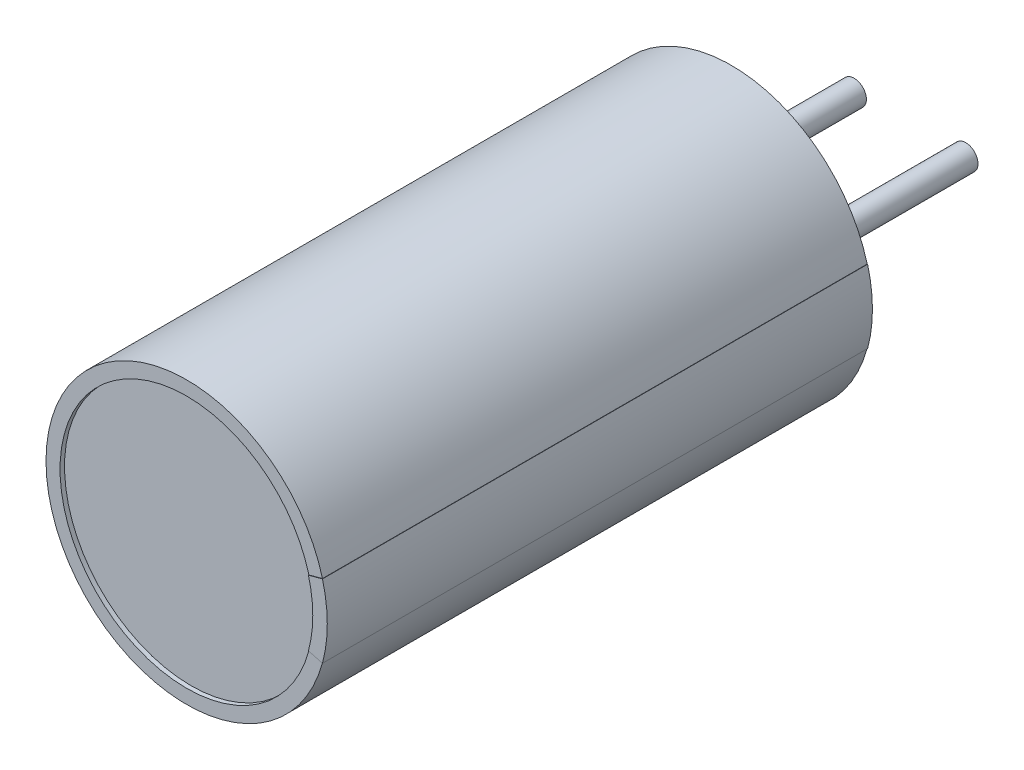
ISO-10303-21;
HEADER;
FILE_DESCRIPTION(('STEP AP214'),'2;1');
FILE_NAME('part.step','',(''),(''),'','','');
FILE_SCHEMA(('AUTOMOTIVE_DESIGN { 1 0 10303 214 1 1 1 1 }'));
ENDSEC;
DATA;
#1=APPLICATION_CONTEXT('core data for automotive mechanical design processes');
#2=APPLICATION_PROTOCOL_DEFINITION('international standard','automotive_design',2000,#1);
#3=PRODUCT_CONTEXT('',#1,'mechanical');
#4=PRODUCT('Part','Part','',(#3));
#5=PRODUCT_RELATED_PRODUCT_CATEGORY('part','',(#4));
#6=PRODUCT_DEFINITION_FORMATION('','',#4);
#7=PRODUCT_DEFINITION_CONTEXT('part definition',#1,'design');
#8=PRODUCT_DEFINITION('design','',#6,#7);
#9=PRODUCT_DEFINITION_SHAPE('','',#8);
#10=(LENGTH_UNIT() NAMED_UNIT(*) SI_UNIT(.MILLI.,.METRE.));
#11=(NAMED_UNIT(*) PLANE_ANGLE_UNIT() SI_UNIT($,.RADIAN.));
#12=(NAMED_UNIT(*) SI_UNIT($,.STERADIAN.) SOLID_ANGLE_UNIT());
#13=UNCERTAINTY_MEASURE_WITH_UNIT(LENGTH_MEASURE(1.E-05),#10,'distance_accuracy_value','');
#14=(GEOMETRIC_REPRESENTATION_CONTEXT(3) GLOBAL_UNCERTAINTY_ASSIGNED_CONTEXT((#13)) GLOBAL_UNIT_ASSIGNED_CONTEXT((#10,
#11,#12)) REPRESENTATION_CONTEXT('',''));
#15=CARTESIAN_POINT('',(0.,0.,0.));
#16=DIRECTION('',(0.,0.,1.));
#17=DIRECTION('',(1.,0.,0.));
#18=AXIS2_PLACEMENT_3D('',#15,#16,#17);
#19=CARTESIAN_POINT('',(-1.24987808,0.000121920000000306,0.));
#20=DIRECTION('',(0.,0.,-1.));
#21=DIRECTION('',(1.,0.,0.));
#22=AXIS2_PLACEMENT_3D('',#19,#20,#21);
#23=CYLINDRICAL_SURFACE('',#22,0.275);
#24=CARTESIAN_POINT('',(-1.24987808,0.000121920000000306,-4.));
#25=DIRECTION('',(0.,0.,1.));
#26=DIRECTION('',(1.,0.,0.));
#27=AXIS2_PLACEMENT_3D('',#24,#25,#26);
#28=CIRCLE('',#27,0.275);
#29=CARTESIAN_POINT('',(-0.97487808,0.000121920000000239,-4.));
#30=VERTEX_POINT('',#29);
#31=EDGE_CURVE('E10',#30,#30,#28,.T.);
#32=ORIENTED_EDGE('',*,*,#31,.T.);
#33=CARTESIAN_POINT('',(-0.97487808,0.000121920000000306,0.));
#34=CARTESIAN_POINT('',(-0.97487808,0.000121920000000306,-4.));
#35=B_SPLINE_CURVE_WITH_KNOTS('',1,(#33,#34),.UNSPECIFIED.,.F.,.F.,(2,2),(0.,4.),.UNSPECIFIED.);
#36=CARTESIAN_POINT('',(-0.97487808,0.000121920000000239,0.));
#37=VERTEX_POINT('',#36);
#38=EDGE_CURVE('E23',#37,#30,#35,.T.);
#39=ORIENTED_EDGE('',*,*,#38,.F.);
#40=CARTESIAN_POINT('',(-1.24987808,0.000121920000000306,0.));
#41=DIRECTION('',(0.,0.,1.));
#42=DIRECTION('',(1.,0.,0.));
#43=AXIS2_PLACEMENT_3D('',#40,#41,#42);
#44=CIRCLE('',#43,0.275);
#45=EDGE_CURVE('E162',#37,#37,#44,.T.);
#46=ORIENTED_EDGE('',*,*,#45,.F.);
#47=ORIENTED_EDGE('',*,*,#38,.T.);
#48=EDGE_LOOP('',(#32,#39,#46,#47));
#49=FACE_BOUND('',#48,.T.);
#50=ADVANCED_FACE('F16',(#49),#23,.T.);
#51=CARTESIAN_POINT('',(-1.24987808,0.000121920000000306,-4.));
#52=DIRECTION('',(0.,0.,1.));
#53=DIRECTION('',(1.,0.,0.));
#54=AXIS2_PLACEMENT_3D('',#51,#52,#53);
#55=PLANE('',#54);
#56=ORIENTED_EDGE('',*,*,#31,.F.);
#57=EDGE_LOOP('',(#56));
#58=FACE_BOUND('',#57,.T.);
#59=ADVANCED_FACE('F190',(#58),#55,.F.);
#60=CARTESIAN_POINT('',(1.25012192,0.000121919999999694,0.));
#61=DIRECTION('',(0.,0.,-1.));
#62=DIRECTION('',(-1.,0.,0.));
#63=AXIS2_PLACEMENT_3D('',#60,#61,#62);
#64=CYLINDRICAL_SURFACE('',#63,0.275);
#65=CARTESIAN_POINT('',(1.25012192,0.000121919999999694,-4.));
#66=DIRECTION('',(0.,0.,1.));
#67=DIRECTION('',(-1.,0.,0.));
#68=AXIS2_PLACEMENT_3D('',#65,#66,#67);
#69=CIRCLE('',#68,0.275);
#70=CARTESIAN_POINT('',(0.97512192,0.000121919999999761,-4.));
#71=VERTEX_POINT('',#70);
#72=EDGE_CURVE('E157',#71,#71,#69,.T.);
#73=ORIENTED_EDGE('',*,*,#72,.T.);
#74=CARTESIAN_POINT('',(0.97512192,0.000121919999999694,0.));
#75=CARTESIAN_POINT('',(0.97512192,0.000121919999999694,-4.));
#76=B_SPLINE_CURVE_WITH_KNOTS('',1,(#74,#75),.UNSPECIFIED.,.F.,.F.,(2,2),(0.,4.),.UNSPECIFIED.);
#77=CARTESIAN_POINT('',(0.97512192,0.000121919999999761,0.));
#78=VERTEX_POINT('',#77);
#79=EDGE_CURVE('E152',#78,#71,#76,.T.);
#80=ORIENTED_EDGE('',*,*,#79,.F.);
#81=CARTESIAN_POINT('',(1.25012192,0.000121919999999694,0.));
#82=DIRECTION('',(0.,0.,1.));
#83=DIRECTION('',(-1.,0.,0.));
#84=AXIS2_PLACEMENT_3D('',#81,#82,#83);
#85=CIRCLE('',#84,0.275);
#86=EDGE_CURVE('E149',#78,#78,#85,.T.);
#87=ORIENTED_EDGE('',*,*,#86,.F.);
#88=ORIENTED_EDGE('',*,*,#79,.T.);
#89=EDGE_LOOP('',(#73,#80,#87,#88));
#90=FACE_BOUND('',#89,.T.);
#91=ADVANCED_FACE('F175',(#90),#64,.T.);
#92=CARTESIAN_POINT('',(1.25012192,0.000121919999999694,-4.));
#93=DIRECTION('',(0.,0.,-1.));
#94=DIRECTION('',(-1.,0.,0.));
#95=AXIS2_PLACEMENT_3D('',#92,#93,#94);
#96=PLANE('',#95);
#97=ORIENTED_EDGE('',*,*,#72,.F.);
#98=EDGE_LOOP('',(#97));
#99=FACE_BOUND('',#98,.T.);
#100=ADVANCED_FACE('F178',(#99),#96,.T.);
#101=CARTESIAN_POINT('',(0.00012192,0.00012192,0.));
#102=DIRECTION('',(0.,0.,1.));
#103=DIRECTION('',(-1.,0.,0.));
#104=AXIS2_PLACEMENT_3D('',#101,#102,#103);
#105=CYLINDRICAL_SURFACE('',#104,3.15);
#106=CARTESIAN_POINT('',(0.00012192,0.00012192,12.2));
#107=DIRECTION('',(0.,0.,-1.));
#108=DIRECTION('',(-1.,0.,0.));
#109=AXIS2_PLACEMENT_3D('',#106,#107,#108);
#110=CIRCLE('',#109,3.15);
#111=CARTESIAN_POINT('',(3.042743176025,-0.815326356951224,12.2));
#112=VERTEX_POINT('',#111);
#113=CARTESIAN_POINT('',(3.042743176025,0.815570196951411,12.2));
#114=VERTEX_POINT('',#113);
#115=EDGE_CURVE('E147',#112,#114,#110,.T.);
#116=ORIENTED_EDGE('',*,*,#115,.T.);
#117=DIRECTION('',(0.,0.,1.));
#118=VECTOR('',#117,1.);
#119=CARTESIAN_POINT('',(3.042743176025,0.815570196951221,6.1));
#120=LINE('',#119,#118);
#121=CARTESIAN_POINT('',(3.042743176025,0.815570196951411,0.));
#122=VERTEX_POINT('',#121);
#123=EDGE_CURVE('E144',#122,#114,#120,.T.);
#124=ORIENTED_EDGE('',*,*,#123,.F.);
#125=CARTESIAN_POINT('',(0.00012192,0.00012192,0.));
#126=DIRECTION('',(0.,0.,-1.));
#127=DIRECTION('',(-1.,0.,0.));
#128=AXIS2_PLACEMENT_3D('',#125,#126,#127);
#129=CIRCLE('',#128,3.15);
#130=CARTESIAN_POINT('',(3.042743176025,-0.815326356951224,0.));
#131=VERTEX_POINT('',#130);
#132=EDGE_CURVE('E142',#131,#122,#129,.T.);
#133=ORIENTED_EDGE('',*,*,#132,.F.);
#134=DIRECTION('',(0.,0.,-1.));
#135=VECTOR('',#134,1.);
#136=CARTESIAN_POINT('',(3.042743176025,-0.815326356951223,6.1));
#137=LINE('',#136,#135);
#138=EDGE_CURVE('E102',#112,#131,#137,.T.);
#139=ORIENTED_EDGE('',*,*,#138,.F.);
#140=EDGE_LOOP('',(#116,#124,#133,#139));
#141=FACE_BOUND('',#140,.T.);
#142=ADVANCED_FACE('F180',(#141),#105,.T.);
#143=CARTESIAN_POINT('',(0.0766368093601971,0.00012192000000244,12.2));
#144=DIRECTION('',(0.,0.,1.));
#145=DIRECTION('',(1.,0.,0.));
#146=AXIS2_PLACEMENT_3D('',#143,#144,#145);
#147=PLANE('',#146);
#148=DIRECTION('',(0.965911509849318,-0.258872468873403,0.));
#149=VECTOR('',#148,1.);
#150=CARTESIAN_POINT('',(1.483475419128,-0.397429386321118,12.2));
#151=LINE('',#150,#149);
#152=CARTESIAN_POINT('',(2.738481050423,-0.733781529256101,12.2));
#153=VERTEX_POINT('',#152);
#154=EDGE_CURVE('E139',#153,#112,#151,.T.);
#155=ORIENTED_EDGE('',*,*,#154,.F.);
#156=CARTESIAN_POINT('',(0.00012192,0.00012192,12.2));
#157=DIRECTION('',(0.,0.,1.));
#158=DIRECTION('',(-1.,0.,0.));
#159=AXIS2_PLACEMENT_3D('',#156,#157,#158);
#160=CIRCLE('',#159,2.835);
#161=CARTESIAN_POINT('',(2.738481050423,0.734025369256276,12.2));
#162=VERTEX_POINT('',#161);
#163=EDGE_CURVE('E136',#162,#153,#160,.T.);
#164=ORIENTED_EDGE('',*,*,#163,.F.);
#165=DIRECTION('',(-0.965911509849318,-0.258872468873403,0.));
#166=VECTOR('',#165,1.);
#167=CARTESIAN_POINT('',(1.483475419128,0.397673226321118,12.2));
#168=LINE('',#167,#166);
#169=EDGE_CURVE('E133',#114,#162,#168,.T.);
#170=ORIENTED_EDGE('',*,*,#169,.F.);
#171=ORIENTED_EDGE('',*,*,#115,.F.);
#172=EDGE_LOOP('',(#155,#164,#170,#171));
#173=FACE_BOUND('',#172,.T.);
#174=ADVANCED_FACE('F187',(#173),#147,.T.);
#175=CARTESIAN_POINT('',(2.895441670773,0.776092145448028,0.));
#176=DIRECTION('',(-0.258872468873403,0.965911509849318,0.));
#177=DIRECTION('',(0.965911509849318,0.258872468873403,0.));
#178=AXIS2_PLACEMENT_3D('',#175,#176,#177);
#179=PLANE('',#178);
#180=ORIENTED_EDGE('',*,*,#123,.T.);
#181=ORIENTED_EDGE('',*,*,#169,.T.);
#182=DIRECTION('',(0.,0.,1.));
#183=VECTOR('',#182,1.);
#184=CARTESIAN_POINT('',(2.738481050423,0.734025369256099,0.));
#185=LINE('',#184,#183);
#186=CARTESIAN_POINT('',(2.738481050423,0.734025369256099,12.21));
#187=VERTEX_POINT('',#186);
#188=EDGE_CURVE('E131',#162,#187,#185,.T.);
#189=ORIENTED_EDGE('',*,*,#188,.T.);
#190=DIRECTION('',(0.965911509849318,0.258872468873403,0.));
#191=VECTOR('',#190,1.);
#192=CARTESIAN_POINT('',(3.052402291124,0.818158921639955,12.21));
#193=LINE('',#192,#191);
#194=CARTESIAN_POINT('',(3.052402291124,0.818158921639956,12.21));
#195=VERTEX_POINT('',#194);
#196=EDGE_CURVE('E129',#187,#195,#193,.T.);
#197=ORIENTED_EDGE('',*,*,#196,.T.);
#198=DIRECTION('',(0.,0.,1.));
#199=VECTOR('',#198,1.);
#200=CARTESIAN_POINT('',(3.052402291124,0.818158921639956,0.));
#201=LINE('',#200,#199);
#202=CARTESIAN_POINT('',(3.052402291124,0.818158921639956,0.));
#203=VERTEX_POINT('',#202);
#204=EDGE_CURVE('E127',#203,#195,#201,.T.);
#205=ORIENTED_EDGE('',*,*,#204,.F.);
#206=DIRECTION('',(-0.965911509849318,-0.258872468873403,0.));
#207=VECTOR('',#206,1.);
#208=CARTESIAN_POINT('',(3.052402291124,0.818158921639955,0.));
#209=LINE('',#208,#207);
#210=EDGE_CURVE('E97',#203,#122,#209,.T.);
#211=ORIENTED_EDGE('',*,*,#210,.T.);
#212=EDGE_LOOP('',(#180,#181,#189,#197,#205,#211));
#213=FACE_BOUND('',#212,.T.);
#214=ADVANCED_FACE('F229',(#213),#179,.T.);
#215=CARTESIAN_POINT('',(0.00012192,0.00012192,0.));
#216=DIRECTION('',(0.,0.,1.));
#217=DIRECTION('',(-1.,0.,0.));
#218=AXIS2_PLACEMENT_3D('',#215,#216,#217);
#219=CYLINDRICAL_SURFACE('',#218,2.835);
#220=ORIENTED_EDGE('',*,*,#163,.T.);
#221=CARTESIAN_POINT('',(2.738481050423,-0.733781529256102,12.1));
#222=CARTESIAN_POINT('',(2.738481050423,-0.733781529256102,12.2));
#223=B_SPLINE_CURVE_WITH_KNOTS('',1,(#221,#222),.UNSPECIFIED.,.F.,.F.,(2,2),(12.1,12.2),.UNSPECIFIED.);
#224=CARTESIAN_POINT('',(2.738481050423,-0.733781529256101,12.1));
#225=VERTEX_POINT('',#224);
#226=EDGE_CURVE('E118',#225,#153,#223,.T.);
#227=ORIENTED_EDGE('',*,*,#226,.F.);
#228=CARTESIAN_POINT('',(0.00012192,0.00012192,12.1));
#229=DIRECTION('',(0.,0.,-1.));
#230=DIRECTION('',(1.,0.,0.));
#231=AXIS2_PLACEMENT_3D('',#228,#229,#230);
#232=CIRCLE('',#231,2.835);
#233=EDGE_CURVE('E115',#225,#225,#232,.T.);
#234=ORIENTED_EDGE('',*,*,#233,.T.);
#235=ORIENTED_EDGE('',*,*,#226,.T.);
#236=DIRECTION('',(0.,0.,1.));
#237=VECTOR('',#236,1.);
#238=CARTESIAN_POINT('',(2.738481050423,-0.733781529256101,0.));
#239=LINE('',#238,#237);
#240=CARTESIAN_POINT('',(2.738481050423,-0.733781529256101,12.21));
#241=VERTEX_POINT('',#240);
#242=EDGE_CURVE('E112',#153,#241,#239,.T.);
#243=ORIENTED_EDGE('',*,*,#242,.T.);
#244=CARTESIAN_POINT('',(0.00012192,0.00012192,12.21));
#245=DIRECTION('',(0.,0.,1.));
#246=DIRECTION('',(-1.,0.,0.));
#247=AXIS2_PLACEMENT_3D('',#244,#245,#246);
#248=CIRCLE('',#247,2.835);
#249=EDGE_CURVE('E109',#241,#187,#248,.T.);
#250=ORIENTED_EDGE('',*,*,#249,.T.);
#251=ORIENTED_EDGE('',*,*,#188,.F.);
#252=EDGE_LOOP('',(#220,#227,#234,#235,#243,#250,#251));
#253=FACE_BOUND('',#252,.T.);
#254=ADVANCED_FACE('F240',(#253),#219,.F.);
#255=CARTESIAN_POINT('',(0.00012192,0.00012192,0.));
#256=DIRECTION('',(0.,0.,1.));
#257=DIRECTION('',(-1.,0.,0.));
#258=AXIS2_PLACEMENT_3D('',#255,#256,#257);
#259=CYLINDRICAL_SURFACE('',#258,3.16);
#260=CARTESIAN_POINT('',(0.00012192,0.00012192,12.21));
#261=DIRECTION('',(0.,0.,-1.));
#262=DIRECTION('',(-1.,0.,0.));
#263=AXIS2_PLACEMENT_3D('',#260,#261,#262);
#264=CIRCLE('',#263,3.16);
#265=CARTESIAN_POINT('',(3.052402291124,-0.817915081639957,12.21));
#266=VERTEX_POINT('',#265);
#267=EDGE_CURVE('E85',#195,#266,#264,.T.);
#268=ORIENTED_EDGE('',*,*,#267,.T.);
#269=DIRECTION('',(0.,0.,1.));
#270=VECTOR('',#269,1.);
#271=CARTESIAN_POINT('',(3.052402291124,-0.817915081639957,0.));
#272=LINE('',#271,#270);
#273=CARTESIAN_POINT('',(3.052402291124,-0.817915081639957,0.));
#274=VERTEX_POINT('',#273);
#275=EDGE_CURVE('E79',#274,#266,#272,.T.);
#276=ORIENTED_EDGE('',*,*,#275,.F.);
#277=CARTESIAN_POINT('',(0.00012192,0.00012192,0.));
#278=DIRECTION('',(0.,0.,-1.));
#279=DIRECTION('',(-1.,0.,0.));
#280=AXIS2_PLACEMENT_3D('',#277,#278,#279);
#281=CIRCLE('',#280,3.16);
#282=EDGE_CURVE('E83',#203,#274,#281,.T.);
#283=ORIENTED_EDGE('',*,*,#282,.F.);
#284=ORIENTED_EDGE('',*,*,#204,.T.);
#285=EDGE_LOOP('',(#268,#276,#283,#284));
#286=FACE_BOUND('',#285,.T.);
#287=ADVANCED_FACE('F81',(#286),#259,.T.);
#288=CARTESIAN_POINT('',(2.895441670773,-0.775848305448029,0.));
#289=DIRECTION('',(-0.258872468873403,-0.965911509849318,0.));
#290=DIRECTION('',(-0.965911509849318,0.258872468873403,0.));
#291=AXIS2_PLACEMENT_3D('',#288,#289,#290);
#292=PLANE('',#291);
#293=ORIENTED_EDGE('',*,*,#138,.T.);
#294=DIRECTION('',(0.965911509849318,-0.258872468873403,0.));
#295=VECTOR('',#294,1.);
#296=CARTESIAN_POINT('',(2.738481050423,-0.733781529256101,0.));
#297=LINE('',#296,#295);
#298=EDGE_CURVE('E95',#131,#274,#297,.T.);
#299=ORIENTED_EDGE('',*,*,#298,.T.);
#300=ORIENTED_EDGE('',*,*,#275,.T.);
#301=DIRECTION('',(-0.965911509849318,0.258872468873403,0.));
#302=VECTOR('',#301,1.);
#303=CARTESIAN_POINT('',(2.738481050423,-0.733781529256101,12.21));
#304=LINE('',#303,#302);
#305=EDGE_CURVE('E104',#266,#241,#304,.T.);
#306=ORIENTED_EDGE('',*,*,#305,.T.);
#307=ORIENTED_EDGE('',*,*,#242,.F.);
#308=ORIENTED_EDGE('',*,*,#154,.T.);
#309=EDGE_LOOP('',(#293,#299,#300,#306,#307,#308));
#310=FACE_BOUND('',#309,.T.);
#311=ADVANCED_FACE('F99',(#310),#292,.T.);
#312=CARTESIAN_POINT('',(2.95337710868,0.000121919999999619,12.21));
#313=DIRECTION('',(0.,0.,1.));
#314=DIRECTION('',(1.,0.,0.));
#315=AXIS2_PLACEMENT_3D('',#312,#313,#314);
#316=PLANE('',#315);
#317=ORIENTED_EDGE('',*,*,#249,.F.);
#318=ORIENTED_EDGE('',*,*,#305,.F.);
#319=ORIENTED_EDGE('',*,*,#267,.F.);
#320=ORIENTED_EDGE('',*,*,#196,.F.);
#321=EDGE_LOOP('',(#317,#318,#319,#320));
#322=FACE_BOUND('',#321,.T.);
#323=ADVANCED_FACE('F264',(#322),#316,.T.);
#324=CARTESIAN_POINT('',(0.00012192,0.00012192,12.1));
#325=DIRECTION('',(0.,0.,1.));
#326=DIRECTION('',(1.,0.,0.));
#327=AXIS2_PLACEMENT_3D('',#324,#325,#326);
#328=PLANE('',#327);
#329=ORIENTED_EDGE('',*,*,#233,.F.);
#330=EDGE_LOOP('',(#329));
#331=FACE_BOUND('',#330,.T.);
#332=ADVANCED_FACE('F171',(#331),#328,.T.);
#333=CARTESIAN_POINT('',(0.00012192,0.00012192,0.));
#334=DIRECTION('',(0.,0.,1.));
#335=DIRECTION('',(1.,0.,0.));
#336=AXIS2_PLACEMENT_3D('',#333,#334,#335);
#337=PLANE('',#336);
#338=ORIENTED_EDGE('',*,*,#45,.T.);
#339=EDGE_LOOP('',(#338));
#340=FACE_BOUND('',#339,.T.);
#341=ORIENTED_EDGE('',*,*,#86,.T.);
#342=EDGE_LOOP('',(#341));
#343=FACE_BOUND('',#342,.T.);
#344=ORIENTED_EDGE('',*,*,#298,.F.);
#345=ORIENTED_EDGE('',*,*,#132,.T.);
#346=ORIENTED_EDGE('',*,*,#210,.F.);
#347=ORIENTED_EDGE('',*,*,#282,.T.);
#348=EDGE_LOOP('',(#344,#345,#346,#347));
#349=FACE_BOUND('',#348,.T.);
#350=ADVANCED_FACE('F93',(#340,#343,#349),#337,.F.);
#351=CLOSED_SHELL('',(#50,#59,#91,#100,#142,#174,#214,#254,#287,#311,#323,#332,#350));
#352=MANIFOLD_SOLID_BREP('B1',#351);
#353=ADVANCED_BREP_SHAPE_REPRESENTATION('',(#18,#352),#14);
#354=SHAPE_DEFINITION_REPRESENTATION(#9,#353);
ENDSEC;
END-ISO-10303-21;
